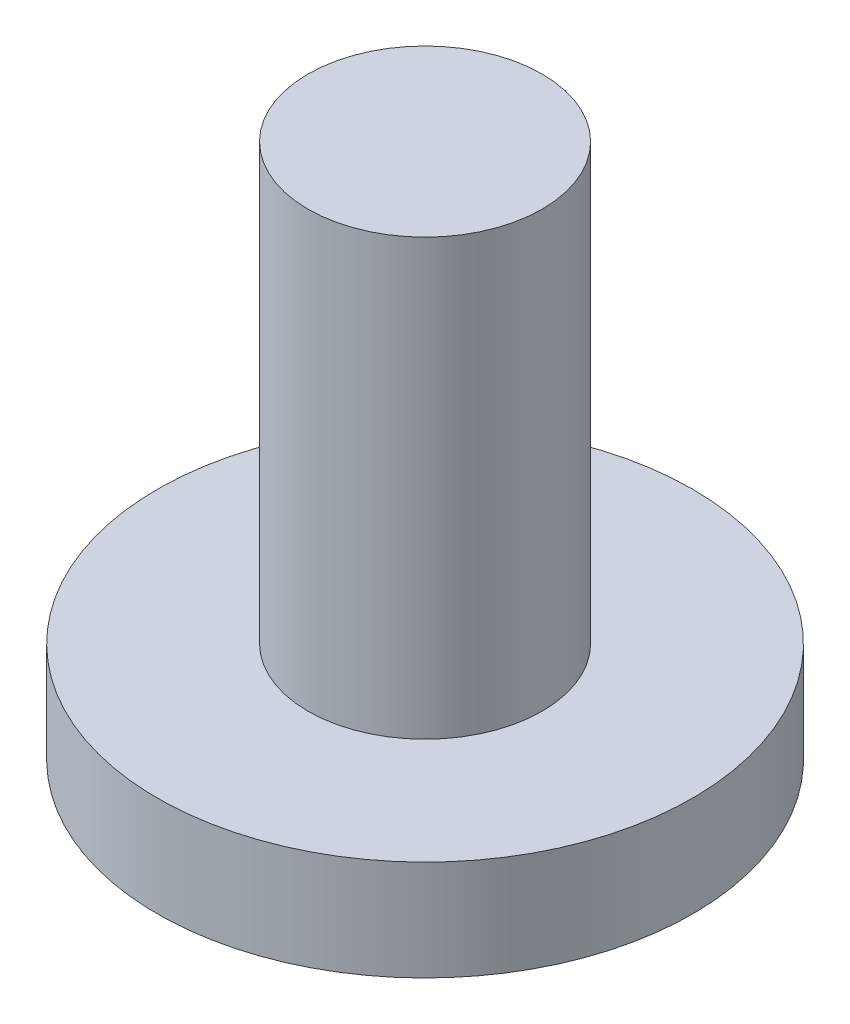
ISO-10303-21;
HEADER;
FILE_DESCRIPTION(('STEP AP214'),'2;1');
FILE_NAME('part.step','',(''),(''),'','','');
FILE_SCHEMA(('AUTOMOTIVE_DESIGN { 1 0 10303 214 1 1 1 1 }'));
ENDSEC;
DATA;
#1=APPLICATION_CONTEXT('core data for automotive mechanical design processes');
#2=APPLICATION_PROTOCOL_DEFINITION('international standard','automotive_design',2000,#1);
#3=PRODUCT_CONTEXT('',#1,'mechanical');
#4=PRODUCT('Part','Part','',(#3));
#5=PRODUCT_RELATED_PRODUCT_CATEGORY('part','',(#4));
#6=PRODUCT_DEFINITION_FORMATION('','',#4);
#7=PRODUCT_DEFINITION_CONTEXT('part definition',#1,'design');
#8=PRODUCT_DEFINITION('design','',#6,#7);
#9=PRODUCT_DEFINITION_SHAPE('','',#8);
#10=(LENGTH_UNIT() NAMED_UNIT(*) SI_UNIT(.MILLI.,.METRE.));
#11=(NAMED_UNIT(*) PLANE_ANGLE_UNIT() SI_UNIT($,.RADIAN.));
#12=(NAMED_UNIT(*) SI_UNIT($,.STERADIAN.) SOLID_ANGLE_UNIT());
#13=UNCERTAINTY_MEASURE_WITH_UNIT(LENGTH_MEASURE(1.E-05),#10,'distance_accuracy_value','');
#14=(GEOMETRIC_REPRESENTATION_CONTEXT(3) GLOBAL_UNCERTAINTY_ASSIGNED_CONTEXT((#13)) GLOBAL_UNIT_ASSIGNED_CONTEXT((#10,
#11,#12)) REPRESENTATION_CONTEXT('',''));
#15=CARTESIAN_POINT('',(0.,0.,0.));
#16=DIRECTION('',(0.,0.,1.));
#17=DIRECTION('',(1.,0.,0.));
#18=AXIS2_PLACEMENT_3D('',#15,#16,#17);
#19=CARTESIAN_POINT('',(0.,8.,0.));
#20=DIRECTION('',(0.,-1.,0.));
#21=DIRECTION('',(0.,0.,-1.));
#22=AXIS2_PLACEMENT_3D('',#19,#20,#21);
#23=CYLINDRICAL_SURFACE('',#22,1.75);
#24=CARTESIAN_POINT('',(0.,8.,0.));
#25=DIRECTION('',(0.,1.,0.));
#26=DIRECTION('',(0.,0.,1.));
#27=AXIS2_PLACEMENT_3D('',#24,#25,#26);
#28=CIRCLE('',#27,1.75);
#29=CARTESIAN_POINT('',(0.,8.,1.75));
#30=VERTEX_POINT('',#29);
#31=EDGE_CURVE('E44',#30,#30,#28,.T.);
#32=ORIENTED_EDGE('',*,*,#31,.F.);
#33=EDGE_LOOP('',(#32));
#34=FACE_BOUND('',#33,.T.);
#35=CARTESIAN_POINT('',(0.,1.5,0.));
#36=DIRECTION('',(0.,-1.,0.));
#37=DIRECTION('',(0.,0.,-1.));
#38=AXIS2_PLACEMENT_3D('',#35,#36,#37);
#39=CIRCLE('',#38,1.75);
#40=CARTESIAN_POINT('',(0.,1.5,-1.75));
#41=VERTEX_POINT('',#40);
#42=EDGE_CURVE('E10',#41,#41,#39,.T.);
#43=ORIENTED_EDGE('',*,*,#42,.F.);
#44=EDGE_LOOP('',(#43));
#45=FACE_BOUND('',#44,.T.);
#46=ADVANCED_FACE('F37',(#34,#45),#23,.T.);
#47=CARTESIAN_POINT('',(0.,8.,0.));
#48=DIRECTION('',(0.,1.,0.));
#49=DIRECTION('',(0.,0.,1.));
#50=AXIS2_PLACEMENT_3D('',#47,#48,#49);
#51=PLANE('',#50);
#52=ORIENTED_EDGE('',*,*,#31,.T.);
#53=EDGE_LOOP('',(#52));
#54=FACE_BOUND('',#53,.T.);
#55=ADVANCED_FACE('F66',(#54),#51,.T.);
#56=CARTESIAN_POINT('',(0.,1.5,0.));
#57=DIRECTION('',(0.,-1.,0.));
#58=DIRECTION('',(0.,0.,-1.));
#59=AXIS2_PLACEMENT_3D('',#56,#57,#58);
#60=CYLINDRICAL_SURFACE('',#59,4.);
#61=CARTESIAN_POINT('',(0.,1.5,0.));
#62=DIRECTION('',(0.,-1.,0.));
#63=DIRECTION('',(0.,0.,-1.));
#64=AXIS2_PLACEMENT_3D('',#61,#62,#63);
#65=CIRCLE('',#64,4.);
#66=CARTESIAN_POINT('',(0.,1.5,-4.));
#67=VERTEX_POINT('',#66);
#68=EDGE_CURVE('E49',#67,#67,#65,.T.);
#69=ORIENTED_EDGE('',*,*,#68,.T.);
#70=EDGE_LOOP('',(#69));
#71=FACE_BOUND('',#70,.T.);
#72=CARTESIAN_POINT('',(0.,0.,0.));
#73=DIRECTION('',(0.,-1.,0.));
#74=DIRECTION('',(0.,0.,-1.));
#75=AXIS2_PLACEMENT_3D('',#72,#73,#74);
#76=CIRCLE('',#75,4.);
#77=CARTESIAN_POINT('',(0.,0.,-4.));
#78=VERTEX_POINT('',#77);
#79=EDGE_CURVE('E54',#78,#78,#76,.T.);
#80=ORIENTED_EDGE('',*,*,#79,.F.);
#81=EDGE_LOOP('',(#80));
#82=FACE_BOUND('',#81,.T.);
#83=ADVANCED_FACE('F63',(#71,#82),#60,.T.);
#84=CARTESIAN_POINT('',(0.,1.5,0.));
#85=DIRECTION('',(0.,-1.,0.));
#86=DIRECTION('',(0.,0.,-1.));
#87=AXIS2_PLACEMENT_3D('',#84,#85,#86);
#88=PLANE('',#87);
#89=ORIENTED_EDGE('',*,*,#42,.T.);
#90=EDGE_LOOP('',(#89));
#91=FACE_BOUND('',#90,.T.);
#92=ORIENTED_EDGE('',*,*,#68,.F.);
#93=EDGE_LOOP('',(#92));
#94=FACE_BOUND('',#93,.T.);
#95=ADVANCED_FACE('F65',(#91,#94),#88,.F.);
#96=CARTESIAN_POINT('',(0.,0.,0.));
#97=DIRECTION('',(0.,1.,0.));
#98=DIRECTION('',(0.,0.,1.));
#99=AXIS2_PLACEMENT_3D('',#96,#97,#98);
#100=PLANE('',#99);
#101=ORIENTED_EDGE('',*,*,#79,.T.);
#102=EDGE_LOOP('',(#101));
#103=FACE_BOUND('',#102,.T.);
#104=ADVANCED_FACE('F61',(#103),#100,.F.);
#105=CLOSED_SHELL('',(#46,#55,#83,#95,#104));
#106=MANIFOLD_SOLID_BREP('B2',#105);
#107=ADVANCED_BREP_SHAPE_REPRESENTATION('',(#18,#106),#14);
#108=SHAPE_DEFINITION_REPRESENTATION(#9,#107);
ENDSEC;
END-ISO-10303-21;
